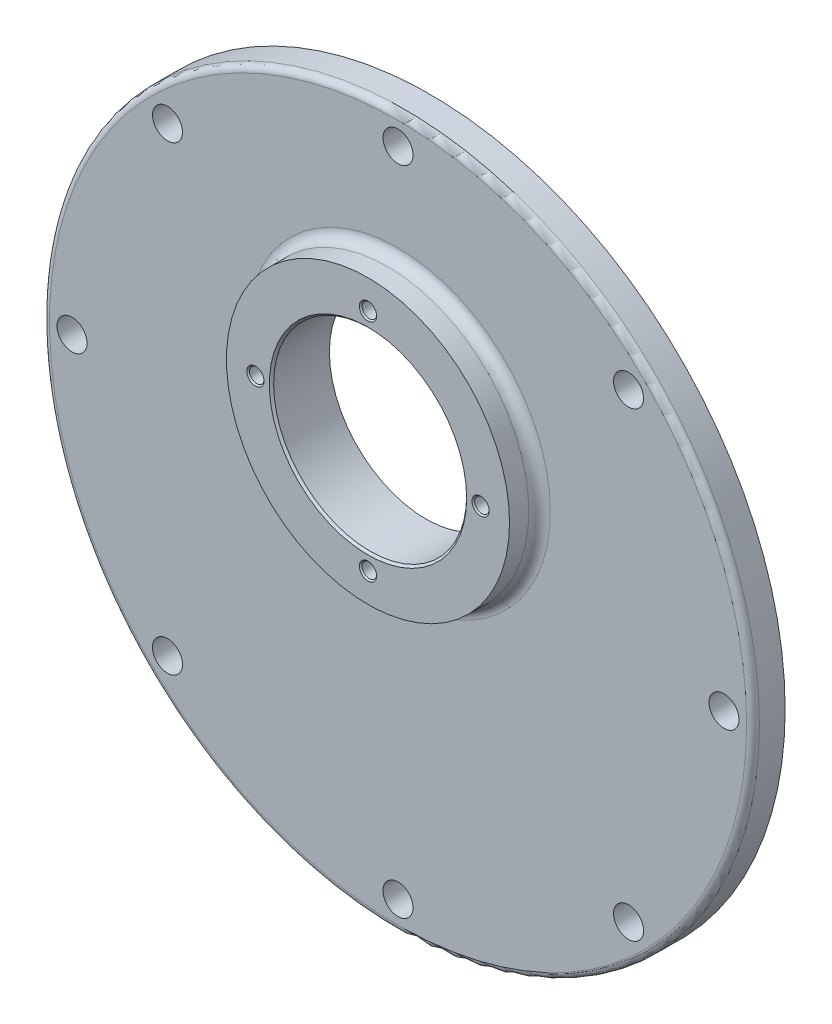
ISO-10303-21;
HEADER;
FILE_DESCRIPTION(('STEP AP214'),'2;1');
FILE_NAME('part.step','',(''),(''),'','','');
FILE_SCHEMA(('AUTOMOTIVE_DESIGN { 1 0 10303 214 1 1 1 1 }'));
ENDSEC;
DATA;
#1=APPLICATION_CONTEXT('core data for automotive mechanical design processes');
#2=APPLICATION_PROTOCOL_DEFINITION('international standard','automotive_design',2000,#1);
#3=PRODUCT_CONTEXT('',#1,'mechanical');
#4=PRODUCT('Part','Part','',(#3));
#5=PRODUCT_RELATED_PRODUCT_CATEGORY('part','',(#4));
#6=PRODUCT_DEFINITION_FORMATION('','',#4);
#7=PRODUCT_DEFINITION_CONTEXT('part definition',#1,'design');
#8=PRODUCT_DEFINITION('design','',#6,#7);
#9=PRODUCT_DEFINITION_SHAPE('','',#8);
#10=(LENGTH_UNIT() NAMED_UNIT(*) SI_UNIT(.MILLI.,.METRE.));
#11=(NAMED_UNIT(*) PLANE_ANGLE_UNIT() SI_UNIT($,.RADIAN.));
#12=(NAMED_UNIT(*) SI_UNIT($,.STERADIAN.) SOLID_ANGLE_UNIT());
#13=UNCERTAINTY_MEASURE_WITH_UNIT(LENGTH_MEASURE(1.E-05),#10,'distance_accuracy_value','');
#14=(GEOMETRIC_REPRESENTATION_CONTEXT(3) GLOBAL_UNCERTAINTY_ASSIGNED_CONTEXT((#13)) GLOBAL_UNIT_ASSIGNED_CONTEXT((#10,
#11,#12)) REPRESENTATION_CONTEXT('',''));
#15=CARTESIAN_POINT('',(0.,0.,0.));
#16=DIRECTION('',(0.,0.,1.));
#17=DIRECTION('',(1.,0.,0.));
#18=AXIS2_PLACEMENT_3D('',#15,#16,#17);
#19=CARTESIAN_POINT('',(0.,0.,6.));
#20=DIRECTION('',(0.,0.,-1.));
#21=DIRECTION('',(-1.,0.,0.));
#22=AXIS2_PLACEMENT_3D('',#19,#20,#21);
#23=CYLINDRICAL_SURFACE('',#22,140.);
#24=CARTESIAN_POINT('',(0.,0.,6.));
#25=DIRECTION('',(0.,0.,1.));
#26=DIRECTION('',(1.,0.,0.));
#27=AXIS2_PLACEMENT_3D('',#24,#25,#26);
#28=CIRCLE('',#27,140.);
#29=CARTESIAN_POINT('',(140.,0.,6.));
#30=VERTEX_POINT('',#29);
#31=EDGE_CURVE('E131',#30,#30,#28,.T.);
#32=ORIENTED_EDGE('',*,*,#31,.F.);
#33=EDGE_LOOP('',(#32));
#34=FACE_BOUND('',#33,.T.);
#35=CARTESIAN_POINT('',(0.,0.,0.));
#36=DIRECTION('',(0.,0.,1.));
#37=DIRECTION('',(1.,0.,0.));
#38=AXIS2_PLACEMENT_3D('',#35,#36,#37);
#39=CIRCLE('',#38,140.);
#40=CARTESIAN_POINT('',(140.,0.,0.));
#41=VERTEX_POINT('',#40);
#42=EDGE_CURVE('E130',#41,#41,#39,.T.);
#43=ORIENTED_EDGE('',*,*,#42,.T.);
#44=EDGE_LOOP('',(#43));
#45=FACE_BOUND('',#44,.T.);
#46=ADVANCED_FACE('F48',(#34,#45),#23,.T.);
#47=CARTESIAN_POINT('',(0.,0.,0.));
#48=DIRECTION('',(0.,0.,1.));
#49=DIRECTION('',(1.,0.,0.));
#50=AXIS2_PLACEMENT_3D('',#47,#48,#49);
#51=PLANE('',#50);
#52=CARTESIAN_POINT('',(0.,0.,0.));
#53=DIRECTION('',(0.,0.,-1.));
#54=DIRECTION('',(-1.,0.,0.));
#55=AXIS2_PLACEMENT_3D('',#52,#53,#54);
#56=CIRCLE('',#55,133.);
#57=CARTESIAN_POINT('',(-133.,0.,0.));
#58=VERTEX_POINT('',#57);
#59=EDGE_CURVE('E121',#58,#58,#56,.T.);
#60=ORIENTED_EDGE('',*,*,#59,.F.);
#61=EDGE_LOOP('',(#60));
#62=FACE_BOUND('',#61,.T.);
#63=ORIENTED_EDGE('',*,*,#42,.F.);
#64=EDGE_LOOP('',(#63));
#65=FACE_BOUND('',#64,.T.);
#66=ADVANCED_FACE('F278',(#62,#65),#51,.F.);
#67=CARTESIAN_POINT('',(0.,0.,510.104689145494));
#68=DIRECTION('',(0.,0.,-1.));
#69=DIRECTION('',(-1.,0.,0.));
#70=AXIS2_PLACEMENT_3D('',#67,#68,#69);
#71=CYLINDRICAL_SURFACE('',#70,165.5);
#72=CARTESIAN_POINT('',(0.,0.,18.));
#73=DIRECTION('',(0.,0.,1.));
#74=DIRECTION('',(1.,0.,0.));
#75=AXIS2_PLACEMENT_3D('',#72,#73,#74);
#76=CIRCLE('',#75,165.5);
#77=CARTESIAN_POINT('',(165.5,0.,18.));
#78=VERTEX_POINT('',#77);
#79=EDGE_CURVE('E13',#78,#78,#76,.F.);
#80=ORIENTED_EDGE('',*,*,#79,.T.);
#81=EDGE_LOOP('',(#80));
#82=FACE_BOUND('',#81,.T.);
#83=CARTESIAN_POINT('',(0.,0.,6.));
#84=DIRECTION('',(0.,0.,1.));
#85=DIRECTION('',(1.,0.,0.));
#86=AXIS2_PLACEMENT_3D('',#83,#84,#85);
#87=CIRCLE('',#86,165.5);
#88=CARTESIAN_POINT('',(165.5,0.,6.));
#89=VERTEX_POINT('',#88);
#90=EDGE_CURVE('E127',#89,#89,#87,.T.);
#91=ORIENTED_EDGE('',*,*,#90,.T.);
#92=EDGE_LOOP('',(#91));
#93=FACE_BOUND('',#92,.T.);
#94=ADVANCED_FACE('F284',(#82,#93),#71,.T.);
#95=CARTESIAN_POINT('',(0.,0.,6.));
#96=DIRECTION('',(0.,0.,1.));
#97=DIRECTION('',(1.,0.,0.));
#98=AXIS2_PLACEMENT_3D('',#95,#96,#97);
#99=PLANE('',#98);
#100=CARTESIAN_POINT('',(152.,0.,6.));
#101=DIRECTION('',(0.,0.,1.));
#102=DIRECTION('',(1.,0.,0.));
#103=AXIS2_PLACEMENT_3D('',#100,#101,#102);
#104=CIRCLE('',#103,4.40000000000001);
#105=CARTESIAN_POINT('',(156.4,0.,6.));
#106=VERTEX_POINT('',#105);
#107=EDGE_CURVE('E52',#106,#106,#104,.T.);
#108=ORIENTED_EDGE('',*,*,#107,.T.);
#109=EDGE_LOOP('',(#108));
#110=FACE_BOUND('',#109,.T.);
#111=CARTESIAN_POINT('',(107.480230740355,-107.480230740355,6.));
#112=DIRECTION('',(0.,0.,1.));
#113=DIRECTION('',(1.,0.,0.));
#114=AXIS2_PLACEMENT_3D('',#111,#112,#113);
#115=CIRCLE('',#114,4.40000000000001);
#116=CARTESIAN_POINT('',(111.880230740355,-107.480230740355,6.));
#117=VERTEX_POINT('',#116);
#118=EDGE_CURVE('E187',#117,#117,#115,.T.);
#119=ORIENTED_EDGE('',*,*,#118,.T.);
#120=EDGE_LOOP('',(#119));
#121=FACE_BOUND('',#120,.T.);
#122=CARTESIAN_POINT('',(-5.30705163504156E-13,-152.,6.));
#123=DIRECTION('',(0.,0.,1.));
#124=DIRECTION('',(1.,0.,0.));
#125=AXIS2_PLACEMENT_3D('',#122,#123,#124);
#126=CIRCLE('',#125,4.40000000000001);
#127=CARTESIAN_POINT('',(4.39999999999948,-152.,6.));
#128=VERTEX_POINT('',#127);
#129=EDGE_CURVE('E183',#128,#128,#126,.T.);
#130=ORIENTED_EDGE('',*,*,#129,.T.);
#131=EDGE_LOOP('',(#130));
#132=FACE_BOUND('',#131,.T.);
#133=CARTESIAN_POINT('',(-107.480230740356,-107.480230740355,6.));
#134=DIRECTION('',(0.,0.,1.));
#135=DIRECTION('',(1.,0.,0.));
#136=AXIS2_PLACEMENT_3D('',#133,#134,#135);
#137=CIRCLE('',#136,4.40000000000001);
#138=CARTESIAN_POINT('',(-103.080230740356,-107.480230740355,6.));
#139=VERTEX_POINT('',#138);
#140=EDGE_CURVE('E178',#139,#139,#137,.T.);
#141=ORIENTED_EDGE('',*,*,#140,.T.);
#142=EDGE_LOOP('',(#141));
#143=FACE_BOUND('',#142,.T.);
#144=CARTESIAN_POINT('',(-152.,1.06141032700831E-12,6.));
#145=DIRECTION('',(0.,0.,1.));
#146=DIRECTION('',(1.,0.,0.));
#147=AXIS2_PLACEMENT_3D('',#144,#145,#146);
#148=CIRCLE('',#147,4.40000000000001);
#149=CARTESIAN_POINT('',(-147.6,1.06141032700831E-12,6.));
#150=VERTEX_POINT('',#149);
#151=EDGE_CURVE('E173',#150,#150,#148,.T.);
#152=ORIENTED_EDGE('',*,*,#151,.T.);
#153=EDGE_LOOP('',(#152));
#154=FACE_BOUND('',#153,.T.);
#155=CARTESIAN_POINT('',(-107.480230740354,107.480230740356,6.));
#156=DIRECTION('',(0.,0.,1.));
#157=DIRECTION('',(1.,0.,0.));
#158=AXIS2_PLACEMENT_3D('',#155,#156,#157);
#159=CIRCLE('',#158,4.40000000000001);
#160=CARTESIAN_POINT('',(-103.080230740354,107.480230740356,6.));
#161=VERTEX_POINT('',#160);
#162=EDGE_CURVE('E168',#161,#161,#159,.T.);
#163=ORIENTED_EDGE('',*,*,#162,.T.);
#164=EDGE_LOOP('',(#163));
#165=FACE_BOUND('',#164,.T.);
#166=CARTESIAN_POINT('',(1.59211549051247E-12,152.,6.));
#167=DIRECTION('',(0.,0.,1.));
#168=DIRECTION('',(1.,0.,0.));
#169=AXIS2_PLACEMENT_3D('',#166,#167,#168);
#170=CIRCLE('',#169,4.40000000000001);
#171=CARTESIAN_POINT('',(4.40000000000161,152.,6.));
#172=VERTEX_POINT('',#171);
#173=EDGE_CURVE('E163',#172,#172,#170,.T.);
#174=ORIENTED_EDGE('',*,*,#173,.T.);
#175=EDGE_LOOP('',(#174));
#176=FACE_BOUND('',#175,.T.);
#177=CARTESIAN_POINT('',(107.480230740357,107.480230740354,6.));
#178=DIRECTION('',(0.,0.,1.));
#179=DIRECTION('',(1.,0.,0.));
#180=AXIS2_PLACEMENT_3D('',#177,#178,#179);
#181=CIRCLE('',#180,4.40000000000001);
#182=CARTESIAN_POINT('',(111.880230740357,107.480230740354,6.));
#183=VERTEX_POINT('',#182);
#184=EDGE_CURVE('E159',#183,#183,#181,.T.);
#185=ORIENTED_EDGE('',*,*,#184,.T.);
#186=EDGE_LOOP('',(#185));
#187=FACE_BOUND('',#186,.T.);
#188=ORIENTED_EDGE('',*,*,#31,.T.);
#189=EDGE_LOOP('',(#188));
#190=FACE_BOUND('',#189,.T.);
#191=ORIENTED_EDGE('',*,*,#90,.F.);
#192=EDGE_LOOP('',(#191));
#193=FACE_BOUND('',#192,.T.);
#194=ADVANCED_FACE('F274',(#110,#121,#132,#143,#154,#165,#176,#187,#190,#193),#99,.F.);
#195=CARTESIAN_POINT('',(0.,0.,21.));
#196=DIRECTION('',(0.,0.,1.));
#197=DIRECTION('',(1.,0.,0.));
#198=AXIS2_PLACEMENT_3D('',#195,#196,#197);
#199=PLANE('',#198);
#200=CARTESIAN_POINT('',(152.,0.,21.));
#201=DIRECTION('',(0.,0.,1.));
#202=DIRECTION('',(1.,0.,0.));
#203=AXIS2_PLACEMENT_3D('',#200,#201,#202);
#204=CIRCLE('',#203,7.00000000000001);
#205=CARTESIAN_POINT('',(159.,0.,21.));
#206=VERTEX_POINT('',#205);
#207=EDGE_CURVE('E752',#206,#206,#204,.T.);
#208=ORIENTED_EDGE('',*,*,#207,.F.);
#209=EDGE_LOOP('',(#208));
#210=FACE_BOUND('',#209,.T.);
#211=CARTESIAN_POINT('',(107.480230740355,-107.480230740355,21.));
#212=DIRECTION('',(0.,0.,1.));
#213=DIRECTION('',(1.,0.,0.));
#214=AXIS2_PLACEMENT_3D('',#211,#212,#213);
#215=CIRCLE('',#214,7.00000000000002);
#216=CARTESIAN_POINT('',(114.480230740355,-107.480230740355,21.));
#217=VERTEX_POINT('',#216);
#218=EDGE_CURVE('E202',#217,#217,#215,.T.);
#219=ORIENTED_EDGE('',*,*,#218,.F.);
#220=EDGE_LOOP('',(#219));
#221=FACE_BOUND('',#220,.T.);
#222=CARTESIAN_POINT('',(-5.30705163504156E-13,-152.,21.));
#223=DIRECTION('',(0.,0.,1.));
#224=DIRECTION('',(1.,0.,0.));
#225=AXIS2_PLACEMENT_3D('',#222,#223,#224);
#226=CIRCLE('',#225,7.00000000000001);
#227=CARTESIAN_POINT('',(6.99999999999948,-152.,21.));
#228=VERTEX_POINT('',#227);
#229=EDGE_CURVE('E189',#228,#228,#226,.T.);
#230=ORIENTED_EDGE('',*,*,#229,.F.);
#231=EDGE_LOOP('',(#230));
#232=FACE_BOUND('',#231,.T.);
#233=CARTESIAN_POINT('',(-107.480230740356,-107.480230740355,21.));
#234=DIRECTION('',(0.,0.,1.));
#235=DIRECTION('',(1.,0.,0.));
#236=AXIS2_PLACEMENT_3D('',#233,#234,#235);
#237=CIRCLE('',#236,7.00000000000002);
#238=CARTESIAN_POINT('',(-100.480230740356,-107.480230740355,21.));
#239=VERTEX_POINT('',#238);
#240=EDGE_CURVE('E185',#239,#239,#237,.T.);
#241=ORIENTED_EDGE('',*,*,#240,.F.);
#242=EDGE_LOOP('',(#241));
#243=FACE_BOUND('',#242,.T.);
#244=CARTESIAN_POINT('',(-152.,1.06141032700831E-12,21.));
#245=DIRECTION('',(0.,0.,1.));
#246=DIRECTION('',(1.,0.,0.));
#247=AXIS2_PLACEMENT_3D('',#244,#245,#246);
#248=CIRCLE('',#247,7.00000000000001);
#249=CARTESIAN_POINT('',(-145.,1.06141032700831E-12,21.));
#250=VERTEX_POINT('',#249);
#251=EDGE_CURVE('E181',#250,#250,#248,.T.);
#252=ORIENTED_EDGE('',*,*,#251,.F.);
#253=EDGE_LOOP('',(#252));
#254=FACE_BOUND('',#253,.T.);
#255=CARTESIAN_POINT('',(-107.480230740354,107.480230740356,21.));
#256=DIRECTION('',(0.,0.,1.));
#257=DIRECTION('',(1.,0.,0.));
#258=AXIS2_PLACEMENT_3D('',#255,#256,#257);
#259=CIRCLE('',#258,7.00000000000002);
#260=CARTESIAN_POINT('',(-100.480230740354,107.480230740356,21.));
#261=VERTEX_POINT('',#260);
#262=EDGE_CURVE('E176',#261,#261,#259,.T.);
#263=ORIENTED_EDGE('',*,*,#262,.F.);
#264=EDGE_LOOP('',(#263));
#265=FACE_BOUND('',#264,.T.);
#266=CARTESIAN_POINT('',(1.59211549051247E-12,152.,21.));
#267=DIRECTION('',(0.,0.,1.));
#268=DIRECTION('',(1.,0.,0.));
#269=AXIS2_PLACEMENT_3D('',#266,#267,#268);
#270=CIRCLE('',#269,7.00000000000001);
#271=CARTESIAN_POINT('',(7.00000000000161,152.,21.));
#272=VERTEX_POINT('',#271);
#273=EDGE_CURVE('E171',#272,#272,#270,.T.);
#274=ORIENTED_EDGE('',*,*,#273,.F.);
#275=EDGE_LOOP('',(#274));
#276=FACE_BOUND('',#275,.T.);
#277=CARTESIAN_POINT('',(107.480230740357,107.480230740354,21.));
#278=DIRECTION('',(0.,0.,1.));
#279=DIRECTION('',(1.,0.,0.));
#280=AXIS2_PLACEMENT_3D('',#277,#278,#279);
#281=CIRCLE('',#280,7.00000000000002);
#282=CARTESIAN_POINT('',(114.480230740357,107.480230740354,21.));
#283=VERTEX_POINT('',#282);
#284=EDGE_CURVE('E166',#283,#283,#281,.T.);
#285=ORIENTED_EDGE('',*,*,#284,.F.);
#286=EDGE_LOOP('',(#285));
#287=FACE_BOUND('',#286,.T.);
#288=CARTESIAN_POINT('',(0.,0.,21.));
#289=DIRECTION('',(0.,0.,1.));
#290=DIRECTION('',(1.,0.,0.));
#291=AXIS2_PLACEMENT_3D('',#288,#289,#290);
#292=CIRCLE('',#291,162.5);
#293=CARTESIAN_POINT('',(162.5,0.,21.));
#294=VERTEX_POINT('',#293);
#295=EDGE_CURVE('E57',#294,#294,#292,.T.);
#296=ORIENTED_EDGE('',*,*,#295,.T.);
#297=EDGE_LOOP('',(#296));
#298=FACE_BOUND('',#297,.T.);
#299=CARTESIAN_POINT('',(0.,40.,21.));
#300=DIRECTION('',(0.,0.,1.));
#301=DIRECTION('',(1.,0.,0.));
#302=AXIS2_PLACEMENT_3D('',#299,#300,#301);
#303=CIRCLE('',#302,71.);
#304=CARTESIAN_POINT('',(71.,40.,21.));
#305=VERTEX_POINT('',#304);
#306=EDGE_CURVE('E139',#305,#305,#303,.F.);
#307=ORIENTED_EDGE('',*,*,#306,.T.);
#308=EDGE_LOOP('',(#307));
#309=FACE_BOUND('',#308,.T.);
#310=ADVANCED_FACE('F266',(#210,#221,#232,#243,#254,#265,#276,#287,#298,#309),#199,.T.);
#311=CARTESIAN_POINT('',(0.,40.,256.676190233249));
#312=DIRECTION('',(0.,0.,-1.));
#313=DIRECTION('',(-1.,0.,0.));
#314=AXIS2_PLACEMENT_3D('',#311,#312,#313);
#315=CYLINDRICAL_SURFACE('',#314,66.);
#316=CARTESIAN_POINT('',(0.,40.,26.));
#317=DIRECTION('',(0.,0.,1.));
#318=DIRECTION('',(1.,0.,0.));
#319=AXIS2_PLACEMENT_3D('',#316,#317,#318);
#320=CIRCLE('',#319,66.);
#321=CARTESIAN_POINT('',(66.,40.,26.));
#322=VERTEX_POINT('',#321);
#323=EDGE_CURVE('E134',#322,#322,#320,.T.);
#324=ORIENTED_EDGE('',*,*,#323,.T.);
#325=EDGE_LOOP('',(#324));
#326=FACE_BOUND('',#325,.T.);
#327=CARTESIAN_POINT('',(0.,40.,35.));
#328=DIRECTION('',(0.,0.,1.));
#329=DIRECTION('',(1.,0.,0.));
#330=AXIS2_PLACEMENT_3D('',#327,#328,#329);
#331=CIRCLE('',#330,66.);
#332=CARTESIAN_POINT('',(66.,40.,35.));
#333=VERTEX_POINT('',#332);
#334=EDGE_CURVE('E124',#333,#333,#331,.T.);
#335=ORIENTED_EDGE('',*,*,#334,.F.);
#336=EDGE_LOOP('',(#335));
#337=FACE_BOUND('',#336,.T.);
#338=ADVANCED_FACE('F253',(#326,#337),#315,.T.);
#339=CARTESIAN_POINT('',(0.,0.,35.));
#340=DIRECTION('',(0.,0.,1.));
#341=DIRECTION('',(1.,0.,0.));
#342=AXIS2_PLACEMENT_3D('',#339,#340,#341);
#343=PLANE('',#342);
#344=CARTESIAN_POINT('',(52.5,40.,35.));
#345=DIRECTION('',(0.,0.,1.));
#346=DIRECTION('',(1.,0.,0.));
#347=AXIS2_PLACEMENT_3D('',#344,#345,#346);
#348=CIRCLE('',#347,4.025);
#349=CARTESIAN_POINT('',(56.525,40.,35.));
#350=VERTEX_POINT('',#349);
#351=EDGE_CURVE('E88',#350,#350,#348,.T.);
#352=ORIENTED_EDGE('',*,*,#351,.F.);
#353=EDGE_LOOP('',(#352));
#354=FACE_BOUND('',#353,.T.);
#355=CARTESIAN_POINT('',(0.,92.5,35.));
#356=DIRECTION('',(0.,0.,1.));
#357=DIRECTION('',(1.,0.,0.));
#358=AXIS2_PLACEMENT_3D('',#355,#356,#357);
#359=CIRCLE('',#358,4.025);
#360=CARTESIAN_POINT('',(4.025,92.5,35.));
#361=VERTEX_POINT('',#360);
#362=EDGE_CURVE('E81',#361,#361,#359,.T.);
#363=ORIENTED_EDGE('',*,*,#362,.F.);
#364=EDGE_LOOP('',(#363));
#365=FACE_BOUND('',#364,.T.);
#366=CARTESIAN_POINT('',(-52.5,40.,35.));
#367=DIRECTION('',(0.,0.,1.));
#368=DIRECTION('',(1.,0.,0.));
#369=AXIS2_PLACEMENT_3D('',#366,#367,#368);
#370=CIRCLE('',#369,4.025);
#371=CARTESIAN_POINT('',(-48.475,40.,35.));
#372=VERTEX_POINT('',#371);
#373=EDGE_CURVE('E97',#372,#372,#370,.T.);
#374=ORIENTED_EDGE('',*,*,#373,.F.);
#375=EDGE_LOOP('',(#374));
#376=FACE_BOUND('',#375,.T.);
#377=CARTESIAN_POINT('',(0.,-12.5,35.));
#378=DIRECTION('',(0.,0.,1.));
#379=DIRECTION('',(1.,0.,0.));
#380=AXIS2_PLACEMENT_3D('',#377,#378,#379);
#381=CIRCLE('',#380,4.025);
#382=CARTESIAN_POINT('',(4.025,-12.5,35.));
#383=VERTEX_POINT('',#382);
#384=EDGE_CURVE('E106',#383,#383,#381,.T.);
#385=ORIENTED_EDGE('',*,*,#384,.F.);
#386=EDGE_LOOP('',(#385));
#387=FACE_BOUND('',#386,.T.);
#388=CARTESIAN_POINT('',(0.,40.,35.));
#389=DIRECTION('',(0.,0.,1.));
#390=DIRECTION('',(1.,0.,0.));
#391=AXIS2_PLACEMENT_3D('',#388,#389,#390);
#392=CIRCLE('',#391,46.0000000000001);
#393=CARTESIAN_POINT('',(46.0000000000001,40.,35.));
#394=VERTEX_POINT('',#393);
#395=EDGE_CURVE('E151',#394,#394,#392,.F.);
#396=ORIENTED_EDGE('',*,*,#395,.T.);
#397=EDGE_LOOP('',(#396));
#398=FACE_BOUND('',#397,.T.);
#399=ORIENTED_EDGE('',*,*,#334,.T.);
#400=EDGE_LOOP('',(#399));
#401=FACE_BOUND('',#400,.T.);
#402=ADVANCED_FACE('F249',(#354,#365,#376,#387,#398,#401),#343,.T.);
#403=CARTESIAN_POINT('',(0.,40.,26.));
#404=DIRECTION('',(0.,0.,1.));
#405=DIRECTION('',(1.,0.,0.));
#406=AXIS2_PLACEMENT_3D('',#403,#404,#405);
#407=TOROIDAL_SURFACE('',#406,71.,5.);
#408=ORIENTED_EDGE('',*,*,#306,.F.);
#409=EDGE_LOOP('',(#408));
#410=FACE_BOUND('',#409,.T.);
#411=ORIENTED_EDGE('',*,*,#323,.F.);
#412=EDGE_LOOP('',(#411));
#413=FACE_BOUND('',#412,.T.);
#414=ADVANCED_FACE('F252',(#410,#413),#407,.F.);
#415=CARTESIAN_POINT('',(0.,0.,11.));
#416=DIRECTION('',(0.,0.,-1.));
#417=DIRECTION('',(-1.,0.,0.));
#418=AXIS2_PLACEMENT_3D('',#415,#416,#417);
#419=CYLINDRICAL_SURFACE('',#418,133.);
#420=CARTESIAN_POINT('',(0.,0.,8.));
#421=DIRECTION('',(0.,0.,-1.));
#422=DIRECTION('',(-1.,0.,0.));
#423=AXIS2_PLACEMENT_3D('',#420,#421,#422);
#424=CIRCLE('',#423,133.);
#425=CARTESIAN_POINT('',(-133.,0.,8.));
#426=VERTEX_POINT('',#425);
#427=EDGE_CURVE('E148',#426,#426,#424,.F.);
#428=ORIENTED_EDGE('',*,*,#427,.T.);
#429=EDGE_LOOP('',(#428));
#430=FACE_BOUND('',#429,.T.);
#431=ORIENTED_EDGE('',*,*,#59,.T.);
#432=EDGE_LOOP('',(#431));
#433=FACE_BOUND('',#432,.T.);
#434=ADVANCED_FACE('F291',(#430,#433),#419,.F.);
#435=CARTESIAN_POINT('',(0.,0.,11.));
#436=DIRECTION('',(0.,0.,-1.));
#437=DIRECTION('',(-1.,0.,0.));
#438=AXIS2_PLACEMENT_3D('',#435,#436,#437);
#439=PLANE('',#438);
#440=CARTESIAN_POINT('',(0.,0.,11.));
#441=DIRECTION('',(0.,0.,-1.));
#442=DIRECTION('',(-1.,0.,0.));
#443=AXIS2_PLACEMENT_3D('',#440,#441,#442);
#444=CIRCLE('',#443,130.);
#445=CARTESIAN_POINT('',(-130.,0.,11.));
#446=VERTEX_POINT('',#445);
#447=EDGE_CURVE('E145',#446,#446,#444,.T.);
#448=ORIENTED_EDGE('',*,*,#447,.T.);
#449=EDGE_LOOP('',(#448));
#450=FACE_BOUND('',#449,.T.);
#451=CARTESIAN_POINT('',(0.,40.,11.));
#452=DIRECTION('',(0.,0.,-1.));
#453=DIRECTION('',(-1.,0.,0.));
#454=AXIS2_PLACEMENT_3D('',#451,#452,#453);
#455=CIRCLE('',#454,58.);
#456=CARTESIAN_POINT('',(-58.,40.,11.));
#457=VERTEX_POINT('',#456);
#458=EDGE_CURVE('E142',#457,#457,#455,.F.);
#459=ORIENTED_EDGE('',*,*,#458,.T.);
#460=EDGE_LOOP('',(#459));
#461=FACE_BOUND('',#460,.T.);
#462=ADVANCED_FACE('F325',(#450,#461),#439,.T.);
#463=CARTESIAN_POINT('',(0.,40.,8.));
#464=DIRECTION('',(0.,0.,-1.));
#465=DIRECTION('',(-1.,0.,0.));
#466=AXIS2_PLACEMENT_3D('',#463,#464,#465);
#467=PLANE('',#466);
#468=CARTESIAN_POINT('',(0.,40.,8.));
#469=DIRECTION('',(0.,0.,-1.));
#470=DIRECTION('',(-1.,0.,0.));
#471=AXIS2_PLACEMENT_3D('',#468,#469,#470);
#472=CIRCLE('',#471,45.);
#473=CARTESIAN_POINT('',(-45.,40.,8.));
#474=VERTEX_POINT('',#473);
#475=EDGE_CURVE('E115',#474,#474,#472,.T.);
#476=ORIENTED_EDGE('',*,*,#475,.F.);
#477=EDGE_LOOP('',(#476));
#478=FACE_BOUND('',#477,.T.);
#479=CARTESIAN_POINT('',(0.,40.,8.));
#480=DIRECTION('',(0.,0.,-1.));
#481=DIRECTION('',(-1.,0.,0.));
#482=AXIS2_PLACEMENT_3D('',#479,#480,#481);
#483=CIRCLE('',#482,55.);
#484=CARTESIAN_POINT('',(-55.,40.,8.));
#485=VERTEX_POINT('',#484);
#486=EDGE_CURVE('E118',#485,#485,#483,.T.);
#487=ORIENTED_EDGE('',*,*,#486,.T.);
#488=EDGE_LOOP('',(#487));
#489=FACE_BOUND('',#488,.T.);
#490=ADVANCED_FACE('F297',(#478,#489),#467,.T.);
#491=CARTESIAN_POINT('',(0.,0.,8.));
#492=DIRECTION('',(0.,0.,-1.));
#493=DIRECTION('',(-1.,0.,0.));
#494=AXIS2_PLACEMENT_3D('',#491,#492,#493);
#495=TOROIDAL_SURFACE('',#494,130.,3.);
#496=ORIENTED_EDGE('',*,*,#427,.F.);
#497=EDGE_LOOP('',(#496));
#498=FACE_BOUND('',#497,.T.);
#499=ORIENTED_EDGE('',*,*,#447,.F.);
#500=EDGE_LOOP('',(#499));
#501=FACE_BOUND('',#500,.T.);
#502=ADVANCED_FACE('F293',(#498,#501),#495,.F.);
#503=CARTESIAN_POINT('',(0.,40.,8.));
#504=DIRECTION('',(0.,0.,-1.));
#505=DIRECTION('',(-1.,0.,0.));
#506=AXIS2_PLACEMENT_3D('',#503,#504,#505);
#507=TOROIDAL_SURFACE('',#506,58.,3.);
#508=ORIENTED_EDGE('',*,*,#458,.F.);
#509=EDGE_LOOP('',(#508));
#510=FACE_BOUND('',#509,.T.);
#511=ORIENTED_EDGE('',*,*,#486,.F.);
#512=EDGE_LOOP('',(#511));
#513=FACE_BOUND('',#512,.T.);
#514=ADVANCED_FACE('F296',(#510,#513),#507,.F.);
#515=CARTESIAN_POINT('',(0.,40.,35.));
#516=DIRECTION('',(0.,0.,-1.));
#517=DIRECTION('',(-1.,0.,0.));
#518=AXIS2_PLACEMENT_3D('',#515,#516,#517);
#519=CYLINDRICAL_SURFACE('',#518,45.);
#520=CARTESIAN_POINT('',(0.,40.,33.9999999999999));
#521=DIRECTION('',(0.,0.,1.));
#522=DIRECTION('',(1.,0.,0.));
#523=AXIS2_PLACEMENT_3D('',#520,#521,#522);
#524=CIRCLE('',#523,45.);
#525=CARTESIAN_POINT('',(45.,40.,33.9999999999999));
#526=VERTEX_POINT('',#525);
#527=EDGE_CURVE('E154',#526,#526,#524,.T.);
#528=ORIENTED_EDGE('',*,*,#527,.T.);
#529=EDGE_LOOP('',(#528));
#530=FACE_BOUND('',#529,.T.);
#531=ORIENTED_EDGE('',*,*,#475,.T.);
#532=EDGE_LOOP('',(#531));
#533=FACE_BOUND('',#532,.T.);
#534=ADVANCED_FACE('F300',(#530,#533),#519,.F.);
#535=CARTESIAN_POINT('',(0.,40.,35.));
#536=DIRECTION('',(0.,0.,1.));
#537=DIRECTION('',(1.,0.,0.));
#538=AXIS2_PLACEMENT_3D('',#535,#536,#537);
#539=CONICAL_SURFACE('',#538,46.0000000000001,0.785398163397462);
#540=ORIENTED_EDGE('',*,*,#527,.F.);
#541=EDGE_LOOP('',(#540));
#542=FACE_BOUND('',#541,.T.);
#543=ORIENTED_EDGE('',*,*,#395,.F.);
#544=EDGE_LOOP('',(#543));
#545=FACE_BOUND('',#544,.T.);
#546=ADVANCED_FACE('F303',(#542,#545),#539,.F.);
#547=CARTESIAN_POINT('',(0.,-12.5,21.0429261046937));
#548=DIRECTION('',(0.,0.,1.));
#549=DIRECTION('',(1.,0.,0.));
#550=AXIS2_PLACEMENT_3D('',#547,#548,#549);
#551=CONICAL_SURFACE('',#550,3.4,1.02974425867665);
#552=CARTESIAN_POINT('',(0.,-12.5,19.));
#553=VERTEX_POINT('',#552);
#554=VERTEX_LOOP('',#553);
#555=FACE_BOUND('',#554,.T.);
#556=CARTESIAN_POINT('',(0.,-12.5,21.0429261046937));
#557=DIRECTION('',(0.,0.,1.));
#558=DIRECTION('',(1.,0.,0.));
#559=AXIS2_PLACEMENT_3D('',#556,#557,#558);
#560=CIRCLE('',#559,3.4);
#561=CARTESIAN_POINT('',(3.4,-12.5,21.0429261046937));
#562=VERTEX_POINT('',#561);
#563=EDGE_CURVE('E112',#562,#562,#560,.T.);
#564=ORIENTED_EDGE('',*,*,#563,.T.);
#565=EDGE_LOOP('',(#564));
#566=FACE_BOUND('',#565,.T.);
#567=ADVANCED_FACE('F307',(#555,#566),#551,.F.);
#568=CARTESIAN_POINT('',(0.,-12.5,35.));
#569=DIRECTION('',(0.,0.,1.));
#570=DIRECTION('',(1.,0.,0.));
#571=AXIS2_PLACEMENT_3D('',#568,#569,#570);
#572=CYLINDRICAL_SURFACE('',#571,3.4);
#573=ORIENTED_EDGE('',*,*,#563,.F.);
#574=EDGE_LOOP('',(#573));
#575=FACE_BOUND('',#574,.T.);
#576=CARTESIAN_POINT('',(0.,-12.5,34.375));
#577=DIRECTION('',(0.,0.,1.));
#578=DIRECTION('',(1.,0.,0.));
#579=AXIS2_PLACEMENT_3D('',#576,#577,#578);
#580=CIRCLE('',#579,3.4);
#581=CARTESIAN_POINT('',(3.4,-12.5,34.375));
#582=VERTEX_POINT('',#581);
#583=EDGE_CURVE('E109',#582,#582,#580,.T.);
#584=ORIENTED_EDGE('',*,*,#583,.T.);
#585=EDGE_LOOP('',(#584));
#586=FACE_BOUND('',#585,.T.);
#587=ADVANCED_FACE('F314',(#575,#586),#572,.F.);
#588=CARTESIAN_POINT('',(0.,-12.5,35.));
#589=DIRECTION('',(0.,0.,1.));
#590=DIRECTION('',(1.,0.,0.));
#591=AXIS2_PLACEMENT_3D('',#588,#589,#590);
#592=CONICAL_SURFACE('',#591,4.025,0.78539816339745);
#593=ORIENTED_EDGE('',*,*,#583,.F.);
#594=EDGE_LOOP('',(#593));
#595=FACE_BOUND('',#594,.T.);
#596=ORIENTED_EDGE('',*,*,#384,.T.);
#597=EDGE_LOOP('',(#596));
#598=FACE_BOUND('',#597,.T.);
#599=ADVANCED_FACE('F392',(#595,#598),#592,.F.);
#600=CARTESIAN_POINT('',(-52.5,40.,21.0429261046937));
#601=DIRECTION('',(0.,0.,1.));
#602=DIRECTION('',(1.,0.,0.));
#603=AXIS2_PLACEMENT_3D('',#600,#601,#602);
#604=CONICAL_SURFACE('',#603,3.39999999999999,1.02974425867665);
#605=CARTESIAN_POINT('',(-52.5,40.,19.));
#606=VERTEX_POINT('',#605);
#607=VERTEX_LOOP('',#606);
#608=FACE_BOUND('',#607,.T.);
#609=CARTESIAN_POINT('',(-52.5,40.,21.0429261046937));
#610=DIRECTION('',(0.,0.,1.));
#611=DIRECTION('',(1.,0.,0.));
#612=AXIS2_PLACEMENT_3D('',#609,#610,#611);
#613=CIRCLE('',#612,3.39999999999999);
#614=CARTESIAN_POINT('',(-49.1,40.,21.0429261046937));
#615=VERTEX_POINT('',#614);
#616=EDGE_CURVE('E103',#615,#615,#613,.T.);
#617=ORIENTED_EDGE('',*,*,#616,.T.);
#618=EDGE_LOOP('',(#617));
#619=FACE_BOUND('',#618,.T.);
#620=ADVANCED_FACE('F404',(#608,#619),#604,.F.);
#621=CARTESIAN_POINT('',(-52.5,40.,35.));
#622=DIRECTION('',(0.,0.,1.));
#623=DIRECTION('',(1.,0.,0.));
#624=AXIS2_PLACEMENT_3D('',#621,#622,#623);
#625=CYLINDRICAL_SURFACE('',#624,3.4);
#626=ORIENTED_EDGE('',*,*,#616,.F.);
#627=EDGE_LOOP('',(#626));
#628=FACE_BOUND('',#627,.T.);
#629=CARTESIAN_POINT('',(-52.5,40.,34.375));
#630=DIRECTION('',(0.,0.,1.));
#631=DIRECTION('',(1.,0.,0.));
#632=AXIS2_PLACEMENT_3D('',#629,#630,#631);
#633=CIRCLE('',#632,3.4);
#634=CARTESIAN_POINT('',(-49.1,40.,34.375));
#635=VERTEX_POINT('',#634);
#636=EDGE_CURVE('E100',#635,#635,#633,.T.);
#637=ORIENTED_EDGE('',*,*,#636,.T.);
#638=EDGE_LOOP('',(#637));
#639=FACE_BOUND('',#638,.T.);
#640=ADVANCED_FACE('F414',(#628,#639),#625,.F.);
#641=CARTESIAN_POINT('',(-52.5,40.,35.));
#642=DIRECTION('',(0.,0.,1.));
#643=DIRECTION('',(1.,0.,0.));
#644=AXIS2_PLACEMENT_3D('',#641,#642,#643);
#645=CONICAL_SURFACE('',#644,4.025,0.785398163397448);
#646=ORIENTED_EDGE('',*,*,#636,.F.);
#647=EDGE_LOOP('',(#646));
#648=FACE_BOUND('',#647,.T.);
#649=ORIENTED_EDGE('',*,*,#373,.T.);
#650=EDGE_LOOP('',(#649));
#651=FACE_BOUND('',#650,.T.);
#652=ADVANCED_FACE('F424',(#648,#651),#645,.F.);
#653=CARTESIAN_POINT('',(0.,92.5,21.0429261046937));
#654=DIRECTION('',(0.,0.,1.));
#655=DIRECTION('',(1.,0.,0.));
#656=AXIS2_PLACEMENT_3D('',#653,#654,#655);
#657=CONICAL_SURFACE('',#656,3.4,1.02974425867665);
#658=CARTESIAN_POINT('',(0.,92.5,19.));
#659=VERTEX_POINT('',#658);
#660=VERTEX_LOOP('',#659);
#661=FACE_BOUND('',#660,.T.);
#662=CARTESIAN_POINT('',(0.,92.5,21.0429261046937));
#663=DIRECTION('',(0.,0.,1.));
#664=DIRECTION('',(1.,0.,0.));
#665=AXIS2_PLACEMENT_3D('',#662,#663,#664);
#666=CIRCLE('',#665,3.4);
#667=CARTESIAN_POINT('',(3.4,92.5,21.0429261046937));
#668=VERTEX_POINT('',#667);
#669=EDGE_CURVE('E94',#668,#668,#666,.T.);
#670=ORIENTED_EDGE('',*,*,#669,.T.);
#671=EDGE_LOOP('',(#670));
#672=FACE_BOUND('',#671,.T.);
#673=ADVANCED_FACE('F436',(#661,#672),#657,.F.);
#674=CARTESIAN_POINT('',(0.,92.5,35.));
#675=DIRECTION('',(0.,0.,1.));
#676=DIRECTION('',(1.,0.,0.));
#677=AXIS2_PLACEMENT_3D('',#674,#675,#676);
#678=CYLINDRICAL_SURFACE('',#677,3.4);
#679=ORIENTED_EDGE('',*,*,#669,.F.);
#680=EDGE_LOOP('',(#679));
#681=FACE_BOUND('',#680,.T.);
#682=CARTESIAN_POINT('',(0.,92.5,34.375));
#683=DIRECTION('',(0.,0.,1.));
#684=DIRECTION('',(1.,0.,0.));
#685=AXIS2_PLACEMENT_3D('',#682,#683,#684);
#686=CIRCLE('',#685,3.4);
#687=CARTESIAN_POINT('',(3.4,92.5,34.375));
#688=VERTEX_POINT('',#687);
#689=EDGE_CURVE('E85',#688,#688,#686,.T.);
#690=ORIENTED_EDGE('',*,*,#689,.T.);
#691=EDGE_LOOP('',(#690));
#692=FACE_BOUND('',#691,.T.);
#693=ADVANCED_FACE('F446',(#681,#692),#678,.F.);
#694=CARTESIAN_POINT('',(0.,92.5,35.));
#695=DIRECTION('',(0.,0.,1.));
#696=DIRECTION('',(1.,0.,0.));
#697=AXIS2_PLACEMENT_3D('',#694,#695,#696);
#698=CONICAL_SURFACE('',#697,4.025,0.78539816339745);
#699=ORIENTED_EDGE('',*,*,#689,.F.);
#700=EDGE_LOOP('',(#699));
#701=FACE_BOUND('',#700,.T.);
#702=ORIENTED_EDGE('',*,*,#362,.T.);
#703=EDGE_LOOP('',(#702));
#704=FACE_BOUND('',#703,.T.);
#705=ADVANCED_FACE('F75',(#701,#704),#698,.F.);
#706=CARTESIAN_POINT('',(52.5,40.,21.0429261046937));
#707=DIRECTION('',(0.,0.,1.));
#708=DIRECTION('',(1.,0.,0.));
#709=AXIS2_PLACEMENT_3D('',#706,#707,#708);
#710=CONICAL_SURFACE('',#709,3.39999999999999,1.02974425867665);
#711=CARTESIAN_POINT('',(52.5,40.,19.));
#712=VERTEX_POINT('',#711);
#713=VERTEX_LOOP('',#712);
#714=FACE_BOUND('',#713,.T.);
#715=CARTESIAN_POINT('',(52.5,40.,21.0429261046937));
#716=DIRECTION('',(0.,0.,1.));
#717=DIRECTION('',(1.,0.,0.));
#718=AXIS2_PLACEMENT_3D('',#715,#716,#717);
#719=CIRCLE('',#718,3.39999999999999);
#720=CARTESIAN_POINT('',(55.9,40.,21.0429261046937));
#721=VERTEX_POINT('',#720);
#722=EDGE_CURVE('E79',#721,#721,#719,.T.);
#723=ORIENTED_EDGE('',*,*,#722,.T.);
#724=EDGE_LOOP('',(#723));
#725=FACE_BOUND('',#724,.T.);
#726=ADVANCED_FACE('F71',(#714,#725),#710,.F.);
#727=CARTESIAN_POINT('',(52.5,40.,35.));
#728=DIRECTION('',(0.,0.,1.));
#729=DIRECTION('',(1.,0.,0.));
#730=AXIS2_PLACEMENT_3D('',#727,#728,#729);
#731=CYLINDRICAL_SURFACE('',#730,3.4);
#732=ORIENTED_EDGE('',*,*,#722,.F.);
#733=EDGE_LOOP('',(#732));
#734=FACE_BOUND('',#733,.T.);
#735=CARTESIAN_POINT('',(52.5,40.,34.375));
#736=DIRECTION('',(0.,0.,1.));
#737=DIRECTION('',(1.,0.,0.));
#738=AXIS2_PLACEMENT_3D('',#735,#736,#737);
#739=CIRCLE('',#738,3.4);
#740=CARTESIAN_POINT('',(55.9,40.,34.375));
#741=VERTEX_POINT('',#740);
#742=EDGE_CURVE('E82',#741,#741,#739,.T.);
#743=ORIENTED_EDGE('',*,*,#742,.T.);
#744=EDGE_LOOP('',(#743));
#745=FACE_BOUND('',#744,.T.);
#746=ADVANCED_FACE('F74',(#734,#745),#731,.F.);
#747=CARTESIAN_POINT('',(52.5,40.,35.));
#748=DIRECTION('',(0.,0.,1.));
#749=DIRECTION('',(1.,0.,0.));
#750=AXIS2_PLACEMENT_3D('',#747,#748,#749);
#751=CONICAL_SURFACE('',#750,4.025,0.785398163397448);
#752=ORIENTED_EDGE('',*,*,#742,.F.);
#753=EDGE_LOOP('',(#752));
#754=FACE_BOUND('',#753,.T.);
#755=ORIENTED_EDGE('',*,*,#351,.T.);
#756=EDGE_LOOP('',(#755));
#757=FACE_BOUND('',#756,.T.);
#758=ADVANCED_FACE('F247',(#754,#757),#751,.F.);
#759=CARTESIAN_POINT('',(0.,0.,18.));
#760=DIRECTION('',(0.,0.,1.));
#761=DIRECTION('',(1.,0.,0.));
#762=AXIS2_PLACEMENT_3D('',#759,#760,#761);
#763=TOROIDAL_SURFACE('',#762,162.5,3.);
#764=ORIENTED_EDGE('',*,*,#79,.F.);
#765=EDGE_LOOP('',(#764));
#766=FACE_BOUND('',#765,.T.);
#767=ORIENTED_EDGE('',*,*,#295,.F.);
#768=EDGE_LOOP('',(#767));
#769=FACE_BOUND('',#768,.T.);
#770=ADVANCED_FACE('F50',(#766,#769),#763,.T.);
#771=CARTESIAN_POINT('',(107.480230740357,107.480230740354,21.));
#772=DIRECTION('',(0.,0.,1.));
#773=DIRECTION('',(1.,0.,0.));
#774=AXIS2_PLACEMENT_3D('',#771,#772,#773);
#775=CYLINDRICAL_SURFACE('',#774,4.40000000000001);
#776=CARTESIAN_POINT('',(107.480230740357,107.480230740354,11.));
#777=DIRECTION('',(0.,0.,1.));
#778=DIRECTION('',(1.,0.,0.));
#779=AXIS2_PLACEMENT_3D('',#776,#777,#778);
#780=CIRCLE('',#779,4.40000000000001);
#781=CARTESIAN_POINT('',(111.880230740357,107.480230740354,11.));
#782=VERTEX_POINT('',#781);
#783=EDGE_CURVE('E162',#782,#782,#780,.T.);
#784=ORIENTED_EDGE('',*,*,#783,.T.);
#785=EDGE_LOOP('',(#784));
#786=FACE_BOUND('',#785,.T.);
#787=ORIENTED_EDGE('',*,*,#184,.F.);
#788=EDGE_LOOP('',(#787));
#789=FACE_BOUND('',#788,.T.);
#790=ADVANCED_FACE('F504',(#786,#789),#775,.F.);
#791=CARTESIAN_POINT('',(111.880230740357,107.480230740354,11.));
#792=DIRECTION('',(0.,0.,-1.));
#793=DIRECTION('',(-1.,0.,0.));
#794=AXIS2_PLACEMENT_3D('',#791,#792,#793);
#795=PLANE('',#794);
#796=ORIENTED_EDGE('',*,*,#783,.F.);
#797=EDGE_LOOP('',(#796));
#798=FACE_BOUND('',#797,.T.);
#799=CARTESIAN_POINT('',(107.480230740357,107.480230740354,11.));
#800=DIRECTION('',(0.,0.,1.));
#801=DIRECTION('',(1.,0.,0.));
#802=AXIS2_PLACEMENT_3D('',#799,#800,#801);
#803=CIRCLE('',#802,7.00000000000001);
#804=CARTESIAN_POINT('',(114.480230740357,107.480230740354,11.));
#805=VERTEX_POINT('',#804);
#806=EDGE_CURVE('E240',#805,#805,#803,.T.);
#807=ORIENTED_EDGE('',*,*,#806,.T.);
#808=EDGE_LOOP('',(#807));
#809=FACE_BOUND('',#808,.T.);
#810=ADVANCED_FACE('F514',(#798,#809),#795,.F.);
#811=CARTESIAN_POINT('',(107.480230740357,107.480230740354,21.));
#812=DIRECTION('',(0.,0.,1.));
#813=DIRECTION('',(1.,0.,0.));
#814=AXIS2_PLACEMENT_3D('',#811,#812,#813);
#815=CYLINDRICAL_SURFACE('',#814,7.00000000000001);
#816=ORIENTED_EDGE('',*,*,#806,.F.);
#817=EDGE_LOOP('',(#816));
#818=FACE_BOUND('',#817,.T.);
#819=ORIENTED_EDGE('',*,*,#284,.T.);
#820=EDGE_LOOP('',(#819));
#821=FACE_BOUND('',#820,.T.);
#822=ADVANCED_FACE('F524',(#818,#821),#815,.F.);
#823=CARTESIAN_POINT('',(1.59211549051247E-12,152.,21.));
#824=DIRECTION('',(0.,0.,1.));
#825=DIRECTION('',(1.,0.,0.));
#826=AXIS2_PLACEMENT_3D('',#823,#824,#825);
#827=CYLINDRICAL_SURFACE('',#826,4.40000000000001);
#828=CARTESIAN_POINT('',(1.59211549051247E-12,152.,11.));
#829=DIRECTION('',(0.,0.,1.));
#830=DIRECTION('',(1.,0.,0.));
#831=AXIS2_PLACEMENT_3D('',#828,#829,#830);
#832=CIRCLE('',#831,4.40000000000001);
#833=CARTESIAN_POINT('',(4.40000000000161,152.,11.));
#834=VERTEX_POINT('',#833);
#835=EDGE_CURVE('E167',#834,#834,#832,.T.);
#836=ORIENTED_EDGE('',*,*,#835,.T.);
#837=EDGE_LOOP('',(#836));
#838=FACE_BOUND('',#837,.T.);
#839=ORIENTED_EDGE('',*,*,#173,.F.);
#840=EDGE_LOOP('',(#839));
#841=FACE_BOUND('',#840,.T.);
#842=ADVANCED_FACE('F534',(#838,#841),#827,.F.);
#843=CARTESIAN_POINT('',(4.40000000000161,152.,11.));
#844=DIRECTION('',(0.,0.,-1.));
#845=DIRECTION('',(-1.,0.,0.));
#846=AXIS2_PLACEMENT_3D('',#843,#844,#845);
#847=PLANE('',#846);
#848=ORIENTED_EDGE('',*,*,#835,.F.);
#849=EDGE_LOOP('',(#848));
#850=FACE_BOUND('',#849,.T.);
#851=CARTESIAN_POINT('',(1.59211549051247E-12,152.,11.));
#852=DIRECTION('',(0.,0.,1.));
#853=DIRECTION('',(1.,0.,0.));
#854=AXIS2_PLACEMENT_3D('',#851,#852,#853);
#855=CIRCLE('',#854,7.00000000000001);
#856=CARTESIAN_POINT('',(7.00000000000161,152.,11.));
#857=VERTEX_POINT('',#856);
#858=EDGE_CURVE('E233',#857,#857,#855,.T.);
#859=ORIENTED_EDGE('',*,*,#858,.T.);
#860=EDGE_LOOP('',(#859));
#861=FACE_BOUND('',#860,.T.);
#862=ADVANCED_FACE('F544',(#850,#861),#847,.F.);
#863=CARTESIAN_POINT('',(1.59211549051247E-12,152.,21.));
#864=DIRECTION('',(0.,0.,1.));
#865=DIRECTION('',(1.,0.,0.));
#866=AXIS2_PLACEMENT_3D('',#863,#864,#865);
#867=CYLINDRICAL_SURFACE('',#866,7.00000000000001);
#868=ORIENTED_EDGE('',*,*,#858,.F.);
#869=EDGE_LOOP('',(#868));
#870=FACE_BOUND('',#869,.T.);
#871=ORIENTED_EDGE('',*,*,#273,.T.);
#872=EDGE_LOOP('',(#871));
#873=FACE_BOUND('',#872,.T.);
#874=ADVANCED_FACE('F554',(#870,#873),#867,.F.);
#875=CARTESIAN_POINT('',(-107.480230740354,107.480230740356,21.));
#876=DIRECTION('',(0.,0.,1.));
#877=DIRECTION('',(1.,0.,0.));
#878=AXIS2_PLACEMENT_3D('',#875,#876,#877);
#879=CYLINDRICAL_SURFACE('',#878,4.40000000000001);
#880=CARTESIAN_POINT('',(-107.480230740354,107.480230740356,11.));
#881=DIRECTION('',(0.,0.,1.));
#882=DIRECTION('',(1.,0.,0.));
#883=AXIS2_PLACEMENT_3D('',#880,#881,#882);
#884=CIRCLE('',#883,4.40000000000001);
#885=CARTESIAN_POINT('',(-103.080230740354,107.480230740356,11.));
#886=VERTEX_POINT('',#885);
#887=EDGE_CURVE('E172',#886,#886,#884,.T.);
#888=ORIENTED_EDGE('',*,*,#887,.T.);
#889=EDGE_LOOP('',(#888));
#890=FACE_BOUND('',#889,.T.);
#891=ORIENTED_EDGE('',*,*,#162,.F.);
#892=EDGE_LOOP('',(#891));
#893=FACE_BOUND('',#892,.T.);
#894=ADVANCED_FACE('F564',(#890,#893),#879,.F.);
#895=CARTESIAN_POINT('',(-103.080230740354,107.480230740356,11.));
#896=DIRECTION('',(0.,0.,-1.));
#897=DIRECTION('',(-1.,0.,0.));
#898=AXIS2_PLACEMENT_3D('',#895,#896,#897);
#899=PLANE('',#898);
#900=ORIENTED_EDGE('',*,*,#887,.F.);
#901=EDGE_LOOP('',(#900));
#902=FACE_BOUND('',#901,.T.);
#903=CARTESIAN_POINT('',(-107.480230740354,107.480230740356,11.));
#904=DIRECTION('',(0.,0.,1.));
#905=DIRECTION('',(1.,0.,0.));
#906=AXIS2_PLACEMENT_3D('',#903,#904,#905);
#907=CIRCLE('',#906,7.00000000000001);
#908=CARTESIAN_POINT('',(-100.480230740354,107.480230740356,11.));
#909=VERTEX_POINT('',#908);
#910=EDGE_CURVE('E226',#909,#909,#907,.T.);
#911=ORIENTED_EDGE('',*,*,#910,.T.);
#912=EDGE_LOOP('',(#911));
#913=FACE_BOUND('',#912,.T.);
#914=ADVANCED_FACE('F574',(#902,#913),#899,.F.);
#915=CARTESIAN_POINT('',(-107.480230740354,107.480230740356,21.));
#916=DIRECTION('',(0.,0.,1.));
#917=DIRECTION('',(1.,0.,0.));
#918=AXIS2_PLACEMENT_3D('',#915,#916,#917);
#919=CYLINDRICAL_SURFACE('',#918,7.00000000000001);
#920=ORIENTED_EDGE('',*,*,#910,.F.);
#921=EDGE_LOOP('',(#920));
#922=FACE_BOUND('',#921,.T.);
#923=ORIENTED_EDGE('',*,*,#262,.T.);
#924=EDGE_LOOP('',(#923));
#925=FACE_BOUND('',#924,.T.);
#926=ADVANCED_FACE('F584',(#922,#925),#919,.F.);
#927=CARTESIAN_POINT('',(-152.,1.06141032700831E-12,21.));
#928=DIRECTION('',(0.,0.,1.));
#929=DIRECTION('',(1.,0.,0.));
#930=AXIS2_PLACEMENT_3D('',#927,#928,#929);
#931=CYLINDRICAL_SURFACE('',#930,4.40000000000001);
#932=CARTESIAN_POINT('',(-152.,1.06141032700831E-12,11.));
#933=DIRECTION('',(0.,0.,1.));
#934=DIRECTION('',(1.,0.,0.));
#935=AXIS2_PLACEMENT_3D('',#932,#933,#934);
#936=CIRCLE('',#935,4.40000000000001);
#937=CARTESIAN_POINT('',(-147.6,1.06141032700831E-12,11.));
#938=VERTEX_POINT('',#937);
#939=EDGE_CURVE('E177',#938,#938,#936,.T.);
#940=ORIENTED_EDGE('',*,*,#939,.T.);
#941=EDGE_LOOP('',(#940));
#942=FACE_BOUND('',#941,.T.);
#943=ORIENTED_EDGE('',*,*,#151,.F.);
#944=EDGE_LOOP('',(#943));
#945=FACE_BOUND('',#944,.T.);
#946=ADVANCED_FACE('F594',(#942,#945),#931,.F.);
#947=CARTESIAN_POINT('',(-147.6,1.06141032700831E-12,11.));
#948=DIRECTION('',(0.,0.,-1.));
#949=DIRECTION('',(-1.,0.,0.));
#950=AXIS2_PLACEMENT_3D('',#947,#948,#949);
#951=PLANE('',#950);
#952=ORIENTED_EDGE('',*,*,#939,.F.);
#953=EDGE_LOOP('',(#952));
#954=FACE_BOUND('',#953,.T.);
#955=CARTESIAN_POINT('',(-152.,1.06141032700831E-12,11.));
#956=DIRECTION('',(0.,0.,1.));
#957=DIRECTION('',(1.,0.,0.));
#958=AXIS2_PLACEMENT_3D('',#955,#956,#957);
#959=CIRCLE('',#958,7.00000000000001);
#960=CARTESIAN_POINT('',(-145.,1.06141032700831E-12,11.));
#961=VERTEX_POINT('',#960);
#962=EDGE_CURVE('E219',#961,#961,#959,.T.);
#963=ORIENTED_EDGE('',*,*,#962,.T.);
#964=EDGE_LOOP('',(#963));
#965=FACE_BOUND('',#964,.T.);
#966=ADVANCED_FACE('F604',(#954,#965),#951,.F.);
#967=CARTESIAN_POINT('',(-152.,1.06141032700831E-12,21.));
#968=DIRECTION('',(0.,0.,1.));
#969=DIRECTION('',(1.,0.,0.));
#970=AXIS2_PLACEMENT_3D('',#967,#968,#969);
#971=CYLINDRICAL_SURFACE('',#970,7.00000000000001);
#972=ORIENTED_EDGE('',*,*,#962,.F.);
#973=EDGE_LOOP('',(#972));
#974=FACE_BOUND('',#973,.T.);
#975=ORIENTED_EDGE('',*,*,#251,.T.);
#976=EDGE_LOOP('',(#975));
#977=FACE_BOUND('',#976,.T.);
#978=ADVANCED_FACE('F614',(#974,#977),#971,.F.);
#979=CARTESIAN_POINT('',(-107.480230740356,-107.480230740355,21.));
#980=DIRECTION('',(0.,0.,1.));
#981=DIRECTION('',(1.,0.,0.));
#982=AXIS2_PLACEMENT_3D('',#979,#980,#981);
#983=CYLINDRICAL_SURFACE('',#982,4.40000000000001);
#984=CARTESIAN_POINT('',(-107.480230740356,-107.480230740355,11.));
#985=DIRECTION('',(0.,0.,1.));
#986=DIRECTION('',(1.,0.,0.));
#987=AXIS2_PLACEMENT_3D('',#984,#985,#986);
#988=CIRCLE('',#987,4.40000000000001);
#989=CARTESIAN_POINT('',(-103.080230740356,-107.480230740355,11.));
#990=VERTEX_POINT('',#989);
#991=EDGE_CURVE('E182',#990,#990,#988,.T.);
#992=ORIENTED_EDGE('',*,*,#991,.T.);
#993=EDGE_LOOP('',(#992));
#994=FACE_BOUND('',#993,.T.);
#995=ORIENTED_EDGE('',*,*,#140,.F.);
#996=EDGE_LOOP('',(#995));
#997=FACE_BOUND('',#996,.T.);
#998=ADVANCED_FACE('F624',(#994,#997),#983,.F.);
#999=CARTESIAN_POINT('',(-103.080230740356,-107.480230740355,11.));
#1000=DIRECTION('',(0.,0.,-1.));
#1001=DIRECTION('',(-1.,0.,0.));
#1002=AXIS2_PLACEMENT_3D('',#999,#1000,#1001);
#1003=PLANE('',#1002);
#1004=ORIENTED_EDGE('',*,*,#991,.F.);
#1005=EDGE_LOOP('',(#1004));
#1006=FACE_BOUND('',#1005,.T.);
#1007=CARTESIAN_POINT('',(-107.480230740356,-107.480230740355,11.));
#1008=DIRECTION('',(0.,0.,1.));
#1009=DIRECTION('',(1.,0.,0.));
#1010=AXIS2_PLACEMENT_3D('',#1007,#1008,#1009);
#1011=CIRCLE('',#1010,7.00000000000002);
#1012=CARTESIAN_POINT('',(-100.480230740356,-107.480230740355,11.));
#1013=VERTEX_POINT('',#1012);
#1014=EDGE_CURVE('E212',#1013,#1013,#1011,.T.);
#1015=ORIENTED_EDGE('',*,*,#1014,.T.);
#1016=EDGE_LOOP('',(#1015));
#1017=FACE_BOUND('',#1016,.T.);
#1018=ADVANCED_FACE('F634',(#1006,#1017),#1003,.F.);
#1019=CARTESIAN_POINT('',(-107.480230740356,-107.480230740355,21.));
#1020=DIRECTION('',(0.,0.,1.));
#1021=DIRECTION('',(1.,0.,0.));
#1022=AXIS2_PLACEMENT_3D('',#1019,#1020,#1021);
#1023=CYLINDRICAL_SURFACE('',#1022,7.00000000000002);
#1024=ORIENTED_EDGE('',*,*,#1014,.F.);
#1025=EDGE_LOOP('',(#1024));
#1026=FACE_BOUND('',#1025,.T.);
#1027=ORIENTED_EDGE('',*,*,#240,.T.);
#1028=EDGE_LOOP('',(#1027));
#1029=FACE_BOUND('',#1028,.T.);
#1030=ADVANCED_FACE('F644',(#1026,#1029),#1023,.F.);
#1031=CARTESIAN_POINT('',(-5.30705163504156E-13,-152.,21.));
#1032=DIRECTION('',(0.,0.,1.));
#1033=DIRECTION('',(1.,0.,0.));
#1034=AXIS2_PLACEMENT_3D('',#1031,#1032,#1033);
#1035=CYLINDRICAL_SURFACE('',#1034,4.40000000000001);
#1036=CARTESIAN_POINT('',(-5.30705163504156E-13,-152.,11.));
#1037=DIRECTION('',(0.,0.,1.));
#1038=DIRECTION('',(1.,0.,0.));
#1039=AXIS2_PLACEMENT_3D('',#1036,#1037,#1038);
#1040=CIRCLE('',#1039,4.40000000000001);
#1041=CARTESIAN_POINT('',(4.39999999999948,-152.,11.));
#1042=VERTEX_POINT('',#1041);
#1043=EDGE_CURVE('E186',#1042,#1042,#1040,.T.);
#1044=ORIENTED_EDGE('',*,*,#1043,.T.);
#1045=EDGE_LOOP('',(#1044));
#1046=FACE_BOUND('',#1045,.T.);
#1047=ORIENTED_EDGE('',*,*,#129,.F.);
#1048=EDGE_LOOP('',(#1047));
#1049=FACE_BOUND('',#1048,.T.);
#1050=ADVANCED_FACE('F654',(#1046,#1049),#1035,.F.);
#1051=CARTESIAN_POINT('',(4.39999999999948,-152.,11.));
#1052=DIRECTION('',(0.,0.,-1.));
#1053=DIRECTION('',(-1.,0.,0.));
#1054=AXIS2_PLACEMENT_3D('',#1051,#1052,#1053);
#1055=PLANE('',#1054);
#1056=ORIENTED_EDGE('',*,*,#1043,.F.);
#1057=EDGE_LOOP('',(#1056));
#1058=FACE_BOUND('',#1057,.T.);
#1059=CARTESIAN_POINT('',(-5.30705163504156E-13,-152.,11.));
#1060=DIRECTION('',(0.,0.,1.));
#1061=DIRECTION('',(1.,0.,0.));
#1062=AXIS2_PLACEMENT_3D('',#1059,#1060,#1061);
#1063=CIRCLE('',#1062,7.00000000000001);
#1064=CARTESIAN_POINT('',(6.99999999999948,-152.,11.));
#1065=VERTEX_POINT('',#1064);
#1066=EDGE_CURVE('E194',#1065,#1065,#1063,.T.);
#1067=ORIENTED_EDGE('',*,*,#1066,.T.);
#1068=EDGE_LOOP('',(#1067));
#1069=FACE_BOUND('',#1068,.T.);
#1070=ADVANCED_FACE('F664',(#1058,#1069),#1055,.F.);
#1071=CARTESIAN_POINT('',(-5.30705163504156E-13,-152.,21.));
#1072=DIRECTION('',(0.,0.,1.));
#1073=DIRECTION('',(1.,0.,0.));
#1074=AXIS2_PLACEMENT_3D('',#1071,#1072,#1073);
#1075=CYLINDRICAL_SURFACE('',#1074,7.00000000000001);
#1076=ORIENTED_EDGE('',*,*,#1066,.F.);
#1077=EDGE_LOOP('',(#1076));
#1078=FACE_BOUND('',#1077,.T.);
#1079=ORIENTED_EDGE('',*,*,#229,.T.);
#1080=EDGE_LOOP('',(#1079));
#1081=FACE_BOUND('',#1080,.T.);
#1082=ADVANCED_FACE('F674',(#1078,#1081),#1075,.F.);
#1083=CARTESIAN_POINT('',(107.480230740355,-107.480230740355,21.));
#1084=DIRECTION('',(0.,0.,1.));
#1085=DIRECTION('',(1.,0.,0.));
#1086=AXIS2_PLACEMENT_3D('',#1083,#1084,#1085);
#1087=CYLINDRICAL_SURFACE('',#1086,4.40000000000001);
#1088=CARTESIAN_POINT('',(107.480230740355,-107.480230740355,11.));
#1089=DIRECTION('',(0.,0.,1.));
#1090=DIRECTION('',(1.,0.,0.));
#1091=AXIS2_PLACEMENT_3D('',#1088,#1089,#1090);
#1092=CIRCLE('',#1091,4.40000000000001);
#1093=CARTESIAN_POINT('',(111.880230740355,-107.480230740355,11.));
#1094=VERTEX_POINT('',#1093);
#1095=EDGE_CURVE('E190',#1094,#1094,#1092,.T.);
#1096=ORIENTED_EDGE('',*,*,#1095,.T.);
#1097=EDGE_LOOP('',(#1096));
#1098=FACE_BOUND('',#1097,.T.);
#1099=ORIENTED_EDGE('',*,*,#118,.F.);
#1100=EDGE_LOOP('',(#1099));
#1101=FACE_BOUND('',#1100,.T.);
#1102=ADVANCED_FACE('F684',(#1098,#1101),#1087,.F.);
#1103=CARTESIAN_POINT('',(111.880230740355,-107.480230740355,11.));
#1104=DIRECTION('',(0.,0.,-1.));
#1105=DIRECTION('',(-1.,0.,0.));
#1106=AXIS2_PLACEMENT_3D('',#1103,#1104,#1105);
#1107=PLANE('',#1106);
#1108=ORIENTED_EDGE('',*,*,#1095,.F.);
#1109=EDGE_LOOP('',(#1108));
#1110=FACE_BOUND('',#1109,.T.);
#1111=CARTESIAN_POINT('',(107.480230740355,-107.480230740355,11.));
#1112=DIRECTION('',(0.,0.,1.));
#1113=DIRECTION('',(1.,0.,0.));
#1114=AXIS2_PLACEMENT_3D('',#1111,#1112,#1113);
#1115=CIRCLE('',#1114,7.00000000000002);
#1116=CARTESIAN_POINT('',(114.480230740355,-107.480230740355,11.));
#1117=VERTEX_POINT('',#1116);
#1118=EDGE_CURVE('E197',#1117,#1117,#1115,.T.);
#1119=ORIENTED_EDGE('',*,*,#1118,.T.);
#1120=EDGE_LOOP('',(#1119));
#1121=FACE_BOUND('',#1120,.T.);
#1122=ADVANCED_FACE('F694',(#1110,#1121),#1107,.F.);
#1123=CARTESIAN_POINT('',(107.480230740355,-107.480230740355,21.));
#1124=DIRECTION('',(0.,0.,1.));
#1125=DIRECTION('',(1.,0.,0.));
#1126=AXIS2_PLACEMENT_3D('',#1123,#1124,#1125);
#1127=CYLINDRICAL_SURFACE('',#1126,7.00000000000002);
#1128=ORIENTED_EDGE('',*,*,#1118,.F.);
#1129=EDGE_LOOP('',(#1128));
#1130=FACE_BOUND('',#1129,.T.);
#1131=ORIENTED_EDGE('',*,*,#218,.T.);
#1132=EDGE_LOOP('',(#1131));
#1133=FACE_BOUND('',#1132,.T.);
#1134=ADVANCED_FACE('F703',(#1130,#1133),#1127,.F.);
#1135=CARTESIAN_POINT('',(152.,0.,21.));
#1136=DIRECTION('',(0.,0.,1.));
#1137=DIRECTION('',(1.,0.,0.));
#1138=AXIS2_PLACEMENT_3D('',#1135,#1136,#1137);
#1139=CYLINDRICAL_SURFACE('',#1138,4.40000000000001);
#1140=CARTESIAN_POINT('',(152.,0.,11.));
#1141=DIRECTION('',(0.,0.,1.));
#1142=DIRECTION('',(1.,0.,0.));
#1143=AXIS2_PLACEMENT_3D('',#1140,#1141,#1142);
#1144=CIRCLE('',#1143,4.40000000000001);
#1145=CARTESIAN_POINT('',(156.4,0.,11.));
#1146=VERTEX_POINT('',#1145);
#1147=EDGE_CURVE('E754',#1146,#1146,#1144,.T.);
#1148=ORIENTED_EDGE('',*,*,#1147,.T.);
#1149=EDGE_LOOP('',(#1148));
#1150=FACE_BOUND('',#1149,.T.);
#1151=ORIENTED_EDGE('',*,*,#107,.F.);
#1152=EDGE_LOOP('',(#1151));
#1153=FACE_BOUND('',#1152,.T.);
#1154=ADVANCED_FACE('F713',(#1150,#1153),#1139,.F.);
#1155=CARTESIAN_POINT('',(156.4,0.,11.));
#1156=DIRECTION('',(0.,0.,-1.));
#1157=DIRECTION('',(-1.,0.,0.));
#1158=AXIS2_PLACEMENT_3D('',#1155,#1156,#1157);
#1159=PLANE('',#1158);
#1160=ORIENTED_EDGE('',*,*,#1147,.F.);
#1161=EDGE_LOOP('',(#1160));
#1162=FACE_BOUND('',#1161,.T.);
#1163=CARTESIAN_POINT('',(152.,0.,11.));
#1164=DIRECTION('',(0.,0.,1.));
#1165=DIRECTION('',(1.,0.,0.));
#1166=AXIS2_PLACEMENT_3D('',#1163,#1164,#1165);
#1167=CIRCLE('',#1166,7.00000000000001);
#1168=CARTESIAN_POINT('',(159.,0.,11.));
#1169=VERTEX_POINT('',#1168);
#1170=EDGE_CURVE('E749',#1169,#1169,#1167,.T.);
#1171=ORIENTED_EDGE('',*,*,#1170,.T.);
#1172=EDGE_LOOP('',(#1171));
#1173=FACE_BOUND('',#1172,.T.);
#1174=ADVANCED_FACE('F723',(#1162,#1173),#1159,.F.);
#1175=CARTESIAN_POINT('',(152.,0.,21.));
#1176=DIRECTION('',(0.,0.,1.));
#1177=DIRECTION('',(1.,0.,0.));
#1178=AXIS2_PLACEMENT_3D('',#1175,#1176,#1177);
#1179=CYLINDRICAL_SURFACE('',#1178,7.00000000000001);
#1180=ORIENTED_EDGE('',*,*,#1170,.F.);
#1181=EDGE_LOOP('',(#1180));
#1182=FACE_BOUND('',#1181,.T.);
#1183=ORIENTED_EDGE('',*,*,#207,.T.);
#1184=EDGE_LOOP('',(#1183));
#1185=FACE_BOUND('',#1184,.T.);
#1186=ADVANCED_FACE('F733',(#1182,#1185),#1179,.F.);
#1187=CLOSED_SHELL('',(#46,#66,#94,#194,#310,#338,#402,#414,#434,#462,#490,#502,#514,#534,#546,
#567,#587,#599,#620,#640,#652,#673,#693,#705,#726,#746,#758,#770,#790,#810,#822,#842,#862,#874,
#894,#914,#926,#946,#966,#978,#998,#1018,#1030,#1050,#1070,#1082,#1102,#1122,#1134,#1154,#1174,#1186));
#1188=MANIFOLD_SOLID_BREP('B2',#1187);
#1189=ADVANCED_BREP_SHAPE_REPRESENTATION('',(#18,#1188),#14);
#1190=SHAPE_DEFINITION_REPRESENTATION(#9,#1189);
ENDSEC;
END-ISO-10303-21;
